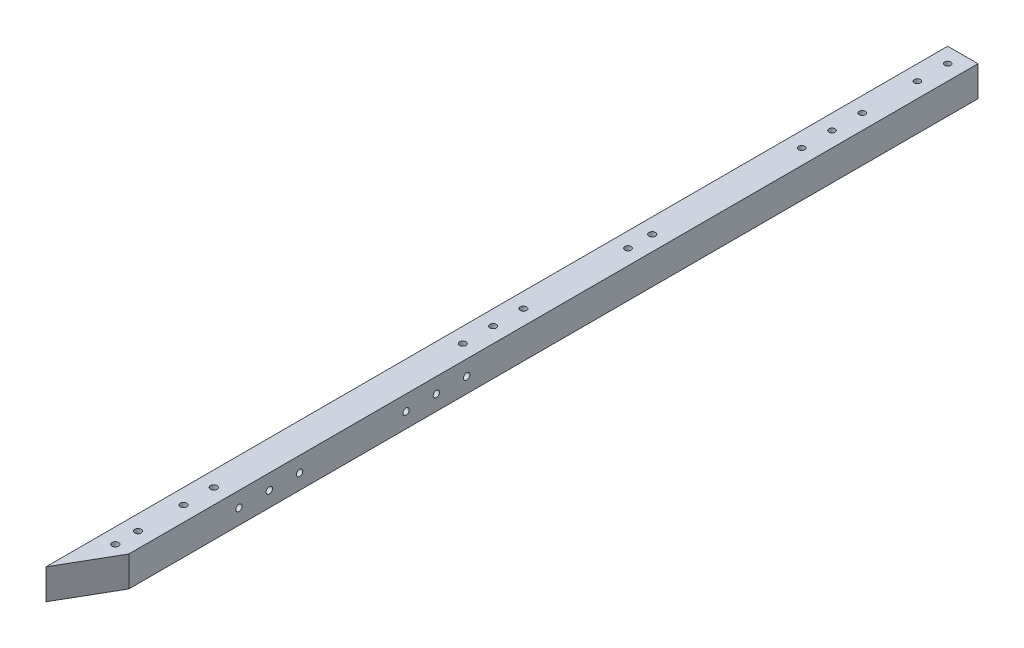
ISO-10303-21;
HEADER;
FILE_DESCRIPTION(('STEP AP214'),'2;1');
FILE_NAME('part.step','',(''),(''),'','','');
FILE_SCHEMA(('AUTOMOTIVE_DESIGN { 1 0 10303 214 1 1 1 1 }'));
ENDSEC;
DATA;
#1=APPLICATION_CONTEXT('core data for automotive mechanical design processes');
#2=APPLICATION_PROTOCOL_DEFINITION('international standard','automotive_design',2000,#1);
#3=PRODUCT_CONTEXT('',#1,'mechanical');
#4=PRODUCT('Part','Part','',(#3));
#5=PRODUCT_RELATED_PRODUCT_CATEGORY('part','',(#4));
#6=PRODUCT_DEFINITION_FORMATION('','',#4);
#7=PRODUCT_DEFINITION_CONTEXT('part definition',#1,'design');
#8=PRODUCT_DEFINITION('design','',#6,#7);
#9=PRODUCT_DEFINITION_SHAPE('','',#8);
#10=(LENGTH_UNIT() NAMED_UNIT(*) SI_UNIT(.MILLI.,.METRE.));
#11=(NAMED_UNIT(*) PLANE_ANGLE_UNIT() SI_UNIT($,.RADIAN.));
#12=(NAMED_UNIT(*) SI_UNIT($,.STERADIAN.) SOLID_ANGLE_UNIT());
#13=UNCERTAINTY_MEASURE_WITH_UNIT(LENGTH_MEASURE(1.E-05),#10,'distance_accuracy_value','');
#14=(GEOMETRIC_REPRESENTATION_CONTEXT(3) GLOBAL_UNCERTAINTY_ASSIGNED_CONTEXT((#13)) GLOBAL_UNIT_ASSIGNED_CONTEXT((#10,
#11,#12)) REPRESENTATION_CONTEXT('',''));
#15=CARTESIAN_POINT('',(0.,0.,0.));
#16=DIRECTION('',(0.,0.,1.));
#17=DIRECTION('',(1.,0.,0.));
#18=AXIS2_PLACEMENT_3D('',#15,#16,#17);
#19=CARTESIAN_POINT('',(0.,0.,595.07));
#20=DIRECTION('',(1.,0.,0.));
#21=DIRECTION('',(0.,0.,-1.));
#22=AXIS2_PLACEMENT_3D('',#19,#20,#21);
#23=PLANE('',#22);
#24=CARTESIAN_POINT('',(0.,9.9999999999999,337.46042392482));
#25=DIRECTION('',(1.,0.,0.));
#26=DIRECTION('',(0.,0.,-1.));
#27=AXIS2_PLACEMENT_3D('',#24,#25,#26);
#28=CIRCLE('',#27,2.10000000000005);
#29=CARTESIAN_POINT('',(0.,9.9999999999999,335.36042392482));
#30=VERTEX_POINT('',#29);
#31=EDGE_CURVE('E191',#30,#30,#28,.T.);
#32=ORIENTED_EDGE('',*,*,#31,.T.);
#33=EDGE_LOOP('',(#32));
#34=FACE_BOUND('',#33,.T.);
#35=CARTESIAN_POINT('',(0.,9.9999999999999,377.46042392482));
#36=DIRECTION('',(1.,0.,0.));
#37=DIRECTION('',(0.,0.,-1.));
#38=AXIS2_PLACEMENT_3D('',#35,#36,#37);
#39=CIRCLE('',#38,2.09999999999999);
#40=CARTESIAN_POINT('',(0.,9.9999999999999,375.36042392482));
#41=VERTEX_POINT('',#40);
#42=EDGE_CURVE('E198',#41,#41,#39,.T.);
#43=ORIENTED_EDGE('',*,*,#42,.T.);
#44=EDGE_LOOP('',(#43));
#45=FACE_BOUND('',#44,.T.);
#46=CARTESIAN_POINT('',(0.,9.9999999999999,357.46042392482));
#47=DIRECTION('',(1.,0.,0.));
#48=DIRECTION('',(0.,0.,-1.));
#49=AXIS2_PLACEMENT_3D('',#46,#47,#48);
#50=CIRCLE('',#49,2.09999999999999);
#51=CARTESIAN_POINT('',(0.,9.9999999999999,355.36042392482));
#52=VERTEX_POINT('',#51);
#53=EDGE_CURVE('E201',#52,#52,#50,.T.);
#54=ORIENTED_EDGE('',*,*,#53,.T.);
#55=EDGE_LOOP('',(#54));
#56=FACE_BOUND('',#55,.T.);
#57=CARTESIAN_POINT('',(0.,9.9999999999999,447.69045380482));
#58=DIRECTION('',(1.,0.,0.));
#59=DIRECTION('',(0.,0.,-1.));
#60=AXIS2_PLACEMENT_3D('',#57,#58,#59);
#61=CIRCLE('',#60,2.09999999999999);
#62=CARTESIAN_POINT('',(0.,9.9999999999999,445.59045380482));
#63=VERTEX_POINT('',#62);
#64=EDGE_CURVE('E204',#63,#63,#61,.T.);
#65=ORIENTED_EDGE('',*,*,#64,.T.);
#66=EDGE_LOOP('',(#65));
#67=FACE_BOUND('',#66,.T.);
#68=CARTESIAN_POINT('',(0.,9.99999999999984,487.69045380482));
#69=DIRECTION('',(1.,0.,0.));
#70=DIRECTION('',(0.,0.,-1.));
#71=AXIS2_PLACEMENT_3D('',#68,#69,#70);
#72=CIRCLE('',#71,2.09999999999999);
#73=CARTESIAN_POINT('',(0.,9.99999999999984,485.59045380482));
#74=VERTEX_POINT('',#73);
#75=EDGE_CURVE('E207',#74,#74,#72,.T.);
#76=ORIENTED_EDGE('',*,*,#75,.T.);
#77=EDGE_LOOP('',(#76));
#78=FACE_BOUND('',#77,.T.);
#79=CARTESIAN_POINT('',(0.,9.99999999999989,467.69045380482));
#80=DIRECTION('',(1.,0.,0.));
#81=DIRECTION('',(0.,0.,-1.));
#82=AXIS2_PLACEMENT_3D('',#79,#80,#81);
#83=CIRCLE('',#82,2.09999999999993);
#84=CARTESIAN_POINT('',(0.,9.99999999999989,465.59045380482));
#85=VERTEX_POINT('',#84);
#86=EDGE_CURVE('E210',#85,#85,#83,.T.);
#87=ORIENTED_EDGE('',*,*,#86,.T.);
#88=EDGE_LOOP('',(#87));
#89=FACE_BOUND('',#88,.T.);
#90=DIRECTION('',(0.,-1.,0.));
#91=VECTOR('',#90,1.);
#92=CARTESIAN_POINT('',(0.,0.,0.));
#93=LINE('',#92,#91);
#94=CARTESIAN_POINT('',(0.,20.,0.));
#95=VERTEX_POINT('',#94);
#96=CARTESIAN_POINT('',(0.,0.,0.));
#97=VERTEX_POINT('',#96);
#98=EDGE_CURVE('E89',#95,#97,#93,.T.);
#99=ORIENTED_EDGE('',*,*,#98,.T.);
#100=DIRECTION('',(0.,0.,-1.));
#101=VECTOR('',#100,1.);
#102=CARTESIAN_POINT('',(0.,0.,595.07));
#103=LINE('',#102,#101);
#104=CARTESIAN_POINT('',(0.,-2.22044604925031E-13,595.07));
#105=VERTEX_POINT('',#104);
#106=EDGE_CURVE('E11',#105,#97,#103,.T.);
#107=ORIENTED_EDGE('',*,*,#106,.F.);
#108=DIRECTION('',(0.,-1.,0.));
#109=VECTOR('',#108,1.);
#110=CARTESIAN_POINT('',(0.,0.,595.07));
#111=LINE('',#110,#109);
#112=CARTESIAN_POINT('',(0.,20.,595.07));
#113=VERTEX_POINT('',#112);
#114=EDGE_CURVE('E90',#113,#105,#111,.T.);
#115=ORIENTED_EDGE('',*,*,#114,.F.);
#116=DIRECTION('',(0.,0.,-1.));
#117=VECTOR('',#116,1.);
#118=CARTESIAN_POINT('',(0.,20.,595.07));
#119=LINE('',#118,#117);
#120=EDGE_CURVE('E76',#113,#95,#119,.T.);
#121=ORIENTED_EDGE('',*,*,#120,.T.);
#122=EDGE_LOOP('',(#99,#107,#115,#121));
#123=FACE_BOUND('',#122,.T.);
#124=ADVANCED_FACE('F36',(#34,#45,#56,#67,#78,#89,#123),#23,.F.);
#125=CARTESIAN_POINT('',(0.,0.,595.07));
#126=DIRECTION('',(0.,1.,0.));
#127=DIRECTION('',(0.,0.,1.));
#128=AXIS2_PLACEMENT_3D('',#125,#126,#127);
#129=PLANE('',#128);
#130=CARTESIAN_POINT('',(10.,0.,205.));
#131=DIRECTION('',(0.,1.,0.));
#132=DIRECTION('',(0.,0.,1.));
#133=AXIS2_PLACEMENT_3D('',#130,#131,#132);
#134=CIRCLE('',#133,2.15);
#135=CARTESIAN_POINT('',(10.,0.,207.15));
#136=VERTEX_POINT('',#135);
#137=EDGE_CURVE('E152',#136,#136,#134,.T.);
#138=ORIENTED_EDGE('',*,*,#137,.T.);
#139=EDGE_LOOP('',(#138));
#140=FACE_BOUND('',#139,.T.);
#141=CARTESIAN_POINT('',(10.,0.,330.));
#142=DIRECTION('',(0.,1.,0.));
#143=DIRECTION('',(0.,0.,1.));
#144=AXIS2_PLACEMENT_3D('',#141,#142,#143);
#145=CIRCLE('',#144,2.09999999999999);
#146=CARTESIAN_POINT('',(10.,0.,332.1));
#147=VERTEX_POINT('',#146);
#148=EDGE_CURVE('E168',#147,#147,#145,.T.);
#149=ORIENTED_EDGE('',*,*,#148,.T.);
#150=EDGE_LOOP('',(#149));
#151=FACE_BOUND('',#150,.T.);
#152=CARTESIAN_POINT('',(10.,0.,290.));
#153=DIRECTION('',(0.,1.,0.));
#154=DIRECTION('',(0.,0.,1.));
#155=AXIS2_PLACEMENT_3D('',#152,#153,#154);
#156=CIRCLE('',#155,2.09999999999999);
#157=CARTESIAN_POINT('',(10.,0.,292.1));
#158=VERTEX_POINT('',#157);
#159=EDGE_CURVE('E171',#158,#158,#156,.T.);
#160=ORIENTED_EDGE('',*,*,#159,.T.);
#161=EDGE_LOOP('',(#160));
#162=FACE_BOUND('',#161,.T.);
#163=CARTESIAN_POINT('',(10.,0.,310.));
#164=DIRECTION('',(0.,1.,0.));
#165=DIRECTION('',(0.,0.,1.));
#166=AXIS2_PLACEMENT_3D('',#163,#164,#165);
#167=CIRCLE('',#166,2.09999999999999);
#168=CARTESIAN_POINT('',(10.,0.,312.1));
#169=VERTEX_POINT('',#168);
#170=EDGE_CURVE('E174',#169,#169,#167,.T.);
#171=ORIENTED_EDGE('',*,*,#170,.T.);
#172=EDGE_LOOP('',(#171));
#173=FACE_BOUND('',#172,.T.);
#174=CARTESIAN_POINT('',(10.,0.,221.));
#175=DIRECTION('',(0.,1.,0.));
#176=DIRECTION('',(0.,0.,1.));
#177=AXIS2_PLACEMENT_3D('',#174,#175,#176);
#178=CIRCLE('',#177,2.09999999999999);
#179=CARTESIAN_POINT('',(10.,0.,223.1));
#180=VERTEX_POINT('',#179);
#181=EDGE_CURVE('E177',#180,#180,#178,.T.);
#182=ORIENTED_EDGE('',*,*,#181,.T.);
#183=EDGE_LOOP('',(#182));
#184=FACE_BOUND('',#183,.T.);
#185=CARTESIAN_POINT('',(9.99999999999999,-2.22044604925031E-13,494.338983848623));
#186=DIRECTION('',(0.,1.,0.));
#187=DIRECTION('',(0.,0.,1.));
#188=AXIS2_PLACEMENT_3D('',#185,#186,#187);
#189=CIRCLE('',#188,2.15);
#190=CARTESIAN_POINT('',(9.99999999999999,-2.22044604925031E-13,496.488983848623));
#191=VERTEX_POINT('',#190);
#192=EDGE_CURVE('E151',#191,#191,#189,.T.);
#193=ORIENTED_EDGE('',*,*,#192,.T.);
#194=EDGE_LOOP('',(#193));
#195=FACE_BOUND('',#194,.T.);
#196=CARTESIAN_POINT('',(9.99999999999999,-2.22044604925031E-13,514.338983848623));
#197=DIRECTION('',(0.,1.,0.));
#198=DIRECTION('',(0.,0.,1.));
#199=AXIS2_PLACEMENT_3D('',#196,#197,#198);
#200=CIRCLE('',#199,2.15);
#201=CARTESIAN_POINT('',(9.99999999999999,-2.22044604925031E-13,516.488983848623));
#202=VERTEX_POINT('',#201);
#203=EDGE_CURVE('E158',#202,#202,#200,.T.);
#204=ORIENTED_EDGE('',*,*,#203,.T.);
#205=EDGE_LOOP('',(#204));
#206=FACE_BOUND('',#205,.T.);
#207=CARTESIAN_POINT('',(9.99999999999999,-2.22044604925031E-13,559.338983848623));
#208=DIRECTION('',(0.,1.,0.));
#209=DIRECTION('',(0.,0.,1.));
#210=AXIS2_PLACEMENT_3D('',#207,#208,#209);
#211=CIRCLE('',#210,2.15000000000001);
#212=CARTESIAN_POINT('',(9.99999999999999,-2.22044604925031E-13,561.488983848623));
#213=VERTEX_POINT('',#212);
#214=EDGE_CURVE('E145',#213,#213,#211,.T.);
#215=ORIENTED_EDGE('',*,*,#214,.T.);
#216=EDGE_LOOP('',(#215));
#217=FACE_BOUND('',#216,.T.);
#218=CARTESIAN_POINT('',(9.99999999999999,-2.22044604925031E-13,544.338983848623));
#219=DIRECTION('',(0.,1.,0.));
#220=DIRECTION('',(0.,0.,1.));
#221=AXIS2_PLACEMENT_3D('',#218,#219,#220);
#222=CIRCLE('',#221,2.15);
#223=CARTESIAN_POINT('',(9.99999999999999,-2.22044604925031E-13,546.488983848623));
#224=VERTEX_POINT('',#223);
#225=EDGE_CURVE('E116',#224,#224,#222,.T.);
#226=ORIENTED_EDGE('',*,*,#225,.T.);
#227=EDGE_LOOP('',(#226));
#228=FACE_BOUND('',#227,.T.);
#229=CARTESIAN_POINT('',(10.,-2.22044604925031E-13,10.));
#230=DIRECTION('',(0.,1.,0.));
#231=DIRECTION('',(0.,0.,1.));
#232=AXIS2_PLACEMENT_3D('',#229,#230,#231);
#233=CIRCLE('',#232,2.);
#234=CARTESIAN_POINT('',(10.,-2.22044604925031E-13,12.));
#235=VERTEX_POINT('',#234);
#236=EDGE_CURVE('E111',#235,#235,#233,.T.);
#237=ORIENTED_EDGE('',*,*,#236,.T.);
#238=EDGE_LOOP('',(#237));
#239=FACE_BOUND('',#238,.T.);
#240=CARTESIAN_POINT('',(10.,-2.22044604925031E-13,30.));
#241=DIRECTION('',(0.,1.,0.));
#242=DIRECTION('',(0.,0.,1.));
#243=AXIS2_PLACEMENT_3D('',#240,#241,#242);
#244=CIRCLE('',#243,2.);
#245=CARTESIAN_POINT('',(10.,-2.22044604925031E-13,32.));
#246=VERTEX_POINT('',#245);
#247=EDGE_CURVE('E134',#246,#246,#244,.T.);
#248=ORIENTED_EDGE('',*,*,#247,.T.);
#249=EDGE_LOOP('',(#248));
#250=FACE_BOUND('',#249,.T.);
#251=CARTESIAN_POINT('',(10.,-2.22044604925031E-13,66.35));
#252=DIRECTION('',(0.,1.,0.));
#253=DIRECTION('',(0.,0.,1.));
#254=AXIS2_PLACEMENT_3D('',#251,#252,#253);
#255=CIRCLE('',#254,2.);
#256=CARTESIAN_POINT('',(10.,-2.22044604925031E-13,68.35));
#257=VERTEX_POINT('',#256);
#258=EDGE_CURVE('E128',#257,#257,#255,.T.);
#259=ORIENTED_EDGE('',*,*,#258,.T.);
#260=EDGE_LOOP('',(#259));
#261=FACE_BOUND('',#260,.T.);
#262=CARTESIAN_POINT('',(10.,-2.22044604925031E-13,86.35));
#263=DIRECTION('',(0.,1.,0.));
#264=DIRECTION('',(0.,0.,1.));
#265=AXIS2_PLACEMENT_3D('',#262,#263,#264);
#266=CIRCLE('',#265,2.);
#267=CARTESIAN_POINT('',(10.,-2.22044604925031E-13,88.35));
#268=VERTEX_POINT('',#267);
#269=EDGE_CURVE('E122',#268,#268,#266,.T.);
#270=ORIENTED_EDGE('',*,*,#269,.T.);
#271=EDGE_LOOP('',(#270));
#272=FACE_BOUND('',#271,.T.);
#273=CARTESIAN_POINT('',(10.,-2.22044604925031E-13,106.35));
#274=DIRECTION('',(0.,1.,0.));
#275=DIRECTION('',(0.,0.,1.));
#276=AXIS2_PLACEMENT_3D('',#273,#274,#275);
#277=CIRCLE('',#276,2.);
#278=CARTESIAN_POINT('',(10.,-2.22044604925031E-13,108.35));
#279=VERTEX_POINT('',#278);
#280=EDGE_CURVE('E115',#279,#279,#277,.T.);
#281=ORIENTED_EDGE('',*,*,#280,.T.);
#282=EDGE_LOOP('',(#281));
#283=FACE_BOUND('',#282,.T.);
#284=DIRECTION('',(0.,0.,-1.));
#285=VECTOR('',#284,1.);
#286=CARTESIAN_POINT('',(20.,0.,595.07));
#287=LINE('',#286,#285);
#288=CARTESIAN_POINT('',(20.,-2.22044604925031E-13,560.428983848623));
#289=VERTEX_POINT('',#288);
#290=CARTESIAN_POINT('',(20.,0.,0.));
#291=VERTEX_POINT('',#290);
#292=EDGE_CURVE('E44',#289,#291,#287,.T.);
#293=ORIENTED_EDGE('',*,*,#292,.F.);
#294=DIRECTION('',(-0.500000000000004,0.,0.866025403784436));
#295=VECTOR('',#294,1.);
#296=CARTESIAN_POINT('',(0.,0.,595.07));
#297=LINE('',#296,#295);
#298=EDGE_CURVE('E102',#289,#105,#297,.T.);
#299=ORIENTED_EDGE('',*,*,#298,.T.);
#300=ORIENTED_EDGE('',*,*,#106,.T.);
#301=DIRECTION('',(1.,0.,0.));
#302=VECTOR('',#301,1.);
#303=CARTESIAN_POINT('',(0.,0.,0.));
#304=LINE('',#303,#302);
#305=EDGE_CURVE('E84',#97,#291,#304,.T.);
#306=ORIENTED_EDGE('',*,*,#305,.T.);
#307=EDGE_LOOP('',(#293,#299,#300,#306));
#308=FACE_BOUND('',#307,.T.);
#309=ADVANCED_FACE('F104',(#140,#151,#162,#173,#184,#195,#206,#217,#228,#239,#250,#261,#272,
#283,#308),#129,.F.);
#310=CARTESIAN_POINT('',(20.,0.,595.07));
#311=DIRECTION('',(-1.,0.,0.));
#312=DIRECTION('',(0.,0.,1.));
#313=AXIS2_PLACEMENT_3D('',#310,#311,#312);
#314=PLANE('',#313);
#315=CARTESIAN_POINT('',(20.,9.9999999999999,337.46042392482));
#316=DIRECTION('',(1.,0.,0.));
#317=DIRECTION('',(0.,0.,-1.));
#318=AXIS2_PLACEMENT_3D('',#315,#316,#317);
#319=CIRCLE('',#318,2.10000000000005);
#320=CARTESIAN_POINT('',(20.,9.9999999999999,335.36042392482));
#321=VERTEX_POINT('',#320);
#322=EDGE_CURVE('E217',#321,#321,#319,.T.);
#323=ORIENTED_EDGE('',*,*,#322,.F.);
#324=EDGE_LOOP('',(#323));
#325=FACE_BOUND('',#324,.T.);
#326=CARTESIAN_POINT('',(20.,9.9999999999999,377.46042392482));
#327=DIRECTION('',(1.,0.,0.));
#328=DIRECTION('',(0.,0.,-1.));
#329=AXIS2_PLACEMENT_3D('',#326,#327,#328);
#330=CIRCLE('',#329,2.09999999999999);
#331=CARTESIAN_POINT('',(20.,9.9999999999999,375.36042392482));
#332=VERTEX_POINT('',#331);
#333=EDGE_CURVE('E220',#332,#332,#330,.T.);
#334=ORIENTED_EDGE('',*,*,#333,.F.);
#335=EDGE_LOOP('',(#334));
#336=FACE_BOUND('',#335,.T.);
#337=CARTESIAN_POINT('',(20.,9.9999999999999,357.46042392482));
#338=DIRECTION('',(1.,0.,0.));
#339=DIRECTION('',(0.,0.,-1.));
#340=AXIS2_PLACEMENT_3D('',#337,#338,#339);
#341=CIRCLE('',#340,2.09999999999999);
#342=CARTESIAN_POINT('',(20.,9.9999999999999,355.36042392482));
#343=VERTEX_POINT('',#342);
#344=EDGE_CURVE('E223',#343,#343,#341,.T.);
#345=ORIENTED_EDGE('',*,*,#344,.F.);
#346=EDGE_LOOP('',(#345));
#347=FACE_BOUND('',#346,.T.);
#348=CARTESIAN_POINT('',(20.,9.9999999999999,447.69045380482));
#349=DIRECTION('',(1.,0.,0.));
#350=DIRECTION('',(0.,0.,-1.));
#351=AXIS2_PLACEMENT_3D('',#348,#349,#350);
#352=CIRCLE('',#351,2.09999999999999);
#353=CARTESIAN_POINT('',(20.,9.9999999999999,445.59045380482));
#354=VERTEX_POINT('',#353);
#355=EDGE_CURVE('E226',#354,#354,#352,.T.);
#356=ORIENTED_EDGE('',*,*,#355,.F.);
#357=EDGE_LOOP('',(#356));
#358=FACE_BOUND('',#357,.T.);
#359=CARTESIAN_POINT('',(20.,9.99999999999984,487.69045380482));
#360=DIRECTION('',(1.,0.,0.));
#361=DIRECTION('',(0.,0.,-1.));
#362=AXIS2_PLACEMENT_3D('',#359,#360,#361);
#363=CIRCLE('',#362,2.09999999999999);
#364=CARTESIAN_POINT('',(20.,9.99999999999984,485.59045380482));
#365=VERTEX_POINT('',#364);
#366=EDGE_CURVE('E216',#365,#365,#363,.T.);
#367=ORIENTED_EDGE('',*,*,#366,.F.);
#368=EDGE_LOOP('',(#367));
#369=FACE_BOUND('',#368,.T.);
#370=CARTESIAN_POINT('',(20.,9.99999999999989,467.69045380482));
#371=DIRECTION('',(1.,0.,0.));
#372=DIRECTION('',(0.,0.,-1.));
#373=AXIS2_PLACEMENT_3D('',#370,#371,#372);
#374=CIRCLE('',#373,2.09999999999993);
#375=CARTESIAN_POINT('',(20.,9.99999999999989,465.59045380482));
#376=VERTEX_POINT('',#375);
#377=EDGE_CURVE('E213',#376,#376,#374,.T.);
#378=ORIENTED_EDGE('',*,*,#377,.F.);
#379=EDGE_LOOP('',(#378));
#380=FACE_BOUND('',#379,.T.);
#381=DIRECTION('',(0.,0.,-1.));
#382=VECTOR('',#381,1.);
#383=CARTESIAN_POINT('',(20.,20.,595.07));
#384=LINE('',#383,#382);
#385=CARTESIAN_POINT('',(20.,20.,560.428983848623));
#386=VERTEX_POINT('',#385);
#387=CARTESIAN_POINT('',(20.,20.,0.));
#388=VERTEX_POINT('',#387);
#389=EDGE_CURVE('E67',#386,#388,#384,.T.);
#390=ORIENTED_EDGE('',*,*,#389,.F.);
#391=DIRECTION('',(0.,1.,0.));
#392=VECTOR('',#391,1.);
#393=CARTESIAN_POINT('',(20.,-575.07,560.428983848623));
#394=LINE('',#393,#392);
#395=EDGE_CURVE('E105',#289,#386,#394,.T.);
#396=ORIENTED_EDGE('',*,*,#395,.F.);
#397=ORIENTED_EDGE('',*,*,#292,.T.);
#398=DIRECTION('',(0.,1.,0.));
#399=VECTOR('',#398,1.);
#400=CARTESIAN_POINT('',(20.,0.,0.));
#401=LINE('',#400,#399);
#402=EDGE_CURVE('E79',#291,#388,#401,.T.);
#403=ORIENTED_EDGE('',*,*,#402,.T.);
#404=EDGE_LOOP('',(#390,#396,#397,#403));
#405=FACE_BOUND('',#404,.T.);
#406=ADVANCED_FACE('F80',(#325,#336,#347,#358,#369,#380,#405),#314,.F.);
#407=CARTESIAN_POINT('',(0.,20.,595.07));
#408=DIRECTION('',(0.,-1.,0.));
#409=DIRECTION('',(0.,0.,-1.));
#410=AXIS2_PLACEMENT_3D('',#407,#408,#409);
#411=PLANE('',#410);
#412=CARTESIAN_POINT('',(10.,20.,205.));
#413=DIRECTION('',(0.,1.,0.));
#414=DIRECTION('',(0.,0.,1.));
#415=AXIS2_PLACEMENT_3D('',#412,#413,#414);
#416=CIRCLE('',#415,2.15);
#417=CARTESIAN_POINT('',(10.,20.,207.15));
#418=VERTEX_POINT('',#417);
#419=EDGE_CURVE('E180',#418,#418,#416,.T.);
#420=ORIENTED_EDGE('',*,*,#419,.F.);
#421=EDGE_LOOP('',(#420));
#422=FACE_BOUND('',#421,.T.);
#423=CARTESIAN_POINT('',(10.,20.,330.));
#424=DIRECTION('',(0.,1.,0.));
#425=DIRECTION('',(0.,0.,1.));
#426=AXIS2_PLACEMENT_3D('',#423,#424,#425);
#427=CIRCLE('',#426,2.09999999999999);
#428=CARTESIAN_POINT('',(10.,20.,332.1));
#429=VERTEX_POINT('',#428);
#430=EDGE_CURVE('E188',#429,#429,#427,.T.);
#431=ORIENTED_EDGE('',*,*,#430,.F.);
#432=EDGE_LOOP('',(#431));
#433=FACE_BOUND('',#432,.T.);
#434=CARTESIAN_POINT('',(10.,20.,290.));
#435=DIRECTION('',(0.,1.,0.));
#436=DIRECTION('',(0.,0.,1.));
#437=AXIS2_PLACEMENT_3D('',#434,#435,#436);
#438=CIRCLE('',#437,2.09999999999999);
#439=CARTESIAN_POINT('',(10.,20.,292.1));
#440=VERTEX_POINT('',#439);
#441=EDGE_CURVE('E185',#440,#440,#438,.T.);
#442=ORIENTED_EDGE('',*,*,#441,.F.);
#443=EDGE_LOOP('',(#442));
#444=FACE_BOUND('',#443,.T.);
#445=CARTESIAN_POINT('',(10.,20.,310.));
#446=DIRECTION('',(0.,1.,0.));
#447=DIRECTION('',(0.,0.,1.));
#448=AXIS2_PLACEMENT_3D('',#445,#446,#447);
#449=CIRCLE('',#448,2.09999999999999);
#450=CARTESIAN_POINT('',(10.,20.,312.1));
#451=VERTEX_POINT('',#450);
#452=EDGE_CURVE('E181',#451,#451,#449,.T.);
#453=ORIENTED_EDGE('',*,*,#452,.F.);
#454=EDGE_LOOP('',(#453));
#455=FACE_BOUND('',#454,.T.);
#456=CARTESIAN_POINT('',(10.,20.,221.));
#457=DIRECTION('',(0.,1.,0.));
#458=DIRECTION('',(0.,0.,1.));
#459=AXIS2_PLACEMENT_3D('',#456,#457,#458);
#460=CIRCLE('',#459,2.09999999999999);
#461=CARTESIAN_POINT('',(10.,20.,223.1));
#462=VERTEX_POINT('',#461);
#463=EDGE_CURVE('E184',#462,#462,#460,.T.);
#464=ORIENTED_EDGE('',*,*,#463,.F.);
#465=EDGE_LOOP('',(#464));
#466=FACE_BOUND('',#465,.T.);
#467=CARTESIAN_POINT('',(9.99999999999999,20.,494.338983848623));
#468=DIRECTION('',(0.,1.,0.));
#469=DIRECTION('',(0.,0.,1.));
#470=AXIS2_PLACEMENT_3D('',#467,#468,#469);
#471=CIRCLE('',#470,2.15);
#472=CARTESIAN_POINT('',(9.99999999999999,20.,496.488983848623));
#473=VERTEX_POINT('',#472);
#474=EDGE_CURVE('E148',#473,#473,#471,.T.);
#475=ORIENTED_EDGE('',*,*,#474,.F.);
#476=EDGE_LOOP('',(#475));
#477=FACE_BOUND('',#476,.T.);
#478=CARTESIAN_POINT('',(9.99999999999999,20.,514.338983848623));
#479=DIRECTION('',(0.,1.,0.));
#480=DIRECTION('',(0.,0.,1.));
#481=AXIS2_PLACEMENT_3D('',#478,#479,#480);
#482=CIRCLE('',#481,2.15);
#483=CARTESIAN_POINT('',(9.99999999999999,20.,516.488983848623));
#484=VERTEX_POINT('',#483);
#485=EDGE_CURVE('E155',#484,#484,#482,.T.);
#486=ORIENTED_EDGE('',*,*,#485,.F.);
#487=EDGE_LOOP('',(#486));
#488=FACE_BOUND('',#487,.T.);
#489=CARTESIAN_POINT('',(9.99999999999999,20.,559.338983848623));
#490=DIRECTION('',(0.,1.,0.));
#491=DIRECTION('',(0.,0.,1.));
#492=AXIS2_PLACEMENT_3D('',#489,#490,#491);
#493=CIRCLE('',#492,2.15000000000001);
#494=CARTESIAN_POINT('',(9.99999999999999,20.,561.488983848623));
#495=VERTEX_POINT('',#494);
#496=EDGE_CURVE('E161',#495,#495,#493,.T.);
#497=ORIENTED_EDGE('',*,*,#496,.F.);
#498=EDGE_LOOP('',(#497));
#499=FACE_BOUND('',#498,.T.);
#500=CARTESIAN_POINT('',(9.99999999999999,20.,544.338983848623));
#501=DIRECTION('',(0.,1.,0.));
#502=DIRECTION('',(0.,0.,1.));
#503=AXIS2_PLACEMENT_3D('',#500,#501,#502);
#504=CIRCLE('',#503,2.15);
#505=CARTESIAN_POINT('',(9.99999999999999,20.,546.488983848623));
#506=VERTEX_POINT('',#505);
#507=EDGE_CURVE('E142',#506,#506,#504,.T.);
#508=ORIENTED_EDGE('',*,*,#507,.F.);
#509=EDGE_LOOP('',(#508));
#510=FACE_BOUND('',#509,.T.);
#511=CARTESIAN_POINT('',(10.,20.,10.));
#512=DIRECTION('',(0.,1.,0.));
#513=DIRECTION('',(0.,0.,1.));
#514=AXIS2_PLACEMENT_3D('',#511,#512,#513);
#515=CIRCLE('',#514,2.);
#516=CARTESIAN_POINT('',(10.,20.,12.));
#517=VERTEX_POINT('',#516);
#518=EDGE_CURVE('E137',#517,#517,#515,.T.);
#519=ORIENTED_EDGE('',*,*,#518,.F.);
#520=EDGE_LOOP('',(#519));
#521=FACE_BOUND('',#520,.T.);
#522=CARTESIAN_POINT('',(10.,20.,30.));
#523=DIRECTION('',(0.,1.,0.));
#524=DIRECTION('',(0.,0.,1.));
#525=AXIS2_PLACEMENT_3D('',#522,#523,#524);
#526=CIRCLE('',#525,2.);
#527=CARTESIAN_POINT('',(10.,20.,32.));
#528=VERTEX_POINT('',#527);
#529=EDGE_CURVE('E131',#528,#528,#526,.T.);
#530=ORIENTED_EDGE('',*,*,#529,.F.);
#531=EDGE_LOOP('',(#530));
#532=FACE_BOUND('',#531,.T.);
#533=CARTESIAN_POINT('',(10.,20.,66.35));
#534=DIRECTION('',(0.,1.,0.));
#535=DIRECTION('',(0.,0.,1.));
#536=AXIS2_PLACEMENT_3D('',#533,#534,#535);
#537=CIRCLE('',#536,2.);
#538=CARTESIAN_POINT('',(10.,20.,68.35));
#539=VERTEX_POINT('',#538);
#540=EDGE_CURVE('E125',#539,#539,#537,.T.);
#541=ORIENTED_EDGE('',*,*,#540,.F.);
#542=EDGE_LOOP('',(#541));
#543=FACE_BOUND('',#542,.T.);
#544=CARTESIAN_POINT('',(10.,20.,86.35));
#545=DIRECTION('',(0.,1.,0.));
#546=DIRECTION('',(0.,0.,1.));
#547=AXIS2_PLACEMENT_3D('',#544,#545,#546);
#548=CIRCLE('',#547,2.);
#549=CARTESIAN_POINT('',(10.,20.,88.35));
#550=VERTEX_POINT('',#549);
#551=EDGE_CURVE('E119',#550,#550,#548,.T.);
#552=ORIENTED_EDGE('',*,*,#551,.F.);
#553=EDGE_LOOP('',(#552));
#554=FACE_BOUND('',#553,.T.);
#555=CARTESIAN_POINT('',(10.,20.,106.35));
#556=DIRECTION('',(0.,1.,0.));
#557=DIRECTION('',(0.,0.,1.));
#558=AXIS2_PLACEMENT_3D('',#555,#556,#557);
#559=CIRCLE('',#558,2.);
#560=CARTESIAN_POINT('',(10.,20.,108.35));
#561=VERTEX_POINT('',#560);
#562=EDGE_CURVE('E112',#561,#561,#559,.T.);
#563=ORIENTED_EDGE('',*,*,#562,.F.);
#564=EDGE_LOOP('',(#563));
#565=FACE_BOUND('',#564,.T.);
#566=ORIENTED_EDGE('',*,*,#120,.F.);
#567=DIRECTION('',(-0.500000000000004,0.,0.866025403784436));
#568=VECTOR('',#567,1.);
#569=CARTESIAN_POINT('',(0.,20.,595.07));
#570=LINE('',#569,#568);
#571=EDGE_CURVE('E51',#386,#113,#570,.T.);
#572=ORIENTED_EDGE('',*,*,#571,.F.);
#573=ORIENTED_EDGE('',*,*,#389,.T.);
#574=DIRECTION('',(-1.,0.,0.));
#575=VECTOR('',#574,1.);
#576=CARTESIAN_POINT('',(0.,20.,0.));
#577=LINE('',#576,#575);
#578=EDGE_CURVE('E71',#388,#95,#577,.T.);
#579=ORIENTED_EDGE('',*,*,#578,.T.);
#580=EDGE_LOOP('',(#566,#572,#573,#579));
#581=FACE_BOUND('',#580,.T.);
#582=ADVANCED_FACE('F69',(#422,#433,#444,#455,#466,#477,#488,#499,#510,#521,#532,#543,#554,#565,
#581),#411,.F.);
#583=CARTESIAN_POINT('',(0.,0.,0.));
#584=DIRECTION('',(0.,0.,-1.));
#585=DIRECTION('',(-1.,0.,0.));
#586=AXIS2_PLACEMENT_3D('',#583,#584,#585);
#587=PLANE('',#586);
#588=ORIENTED_EDGE('',*,*,#98,.F.);
#589=ORIENTED_EDGE('',*,*,#578,.F.);
#590=ORIENTED_EDGE('',*,*,#402,.F.);
#591=ORIENTED_EDGE('',*,*,#305,.F.);
#592=EDGE_LOOP('',(#588,#589,#590,#591));
#593=FACE_BOUND('',#592,.T.);
#594=ADVANCED_FACE('F87',(#593),#587,.T.);
#595=CARTESIAN_POINT('',(0.,-575.07,595.07));
#596=DIRECTION('',(-0.866025403784436,0.,-0.500000000000004));
#597=DIRECTION('',(-0.500000000000004,0.,0.866025403784436));
#598=AXIS2_PLACEMENT_3D('',#595,#596,#597);
#599=PLANE('',#598);
#600=ORIENTED_EDGE('',*,*,#395,.T.);
#601=ORIENTED_EDGE('',*,*,#571,.T.);
#602=ORIENTED_EDGE('',*,*,#114,.T.);
#603=ORIENTED_EDGE('',*,*,#298,.F.);
#604=EDGE_LOOP('',(#600,#601,#602,#603));
#605=FACE_BOUND('',#604,.T.);
#606=ADVANCED_FACE('F100',(#605),#599,.F.);
#607=CARTESIAN_POINT('',(10.,-2.22044604925031E-13,106.35));
#608=DIRECTION('',(0.,1.,0.));
#609=DIRECTION('',(0.,0.,1.));
#610=AXIS2_PLACEMENT_3D('',#607,#608,#609);
#611=CYLINDRICAL_SURFACE('',#610,2.);
#612=ORIENTED_EDGE('',*,*,#280,.F.);
#613=EDGE_LOOP('',(#612));
#614=FACE_BOUND('',#613,.T.);
#615=ORIENTED_EDGE('',*,*,#562,.T.);
#616=EDGE_LOOP('',(#615));
#617=FACE_BOUND('',#616,.T.);
#618=ADVANCED_FACE('F334',(#614,#617),#611,.F.);
#619=CARTESIAN_POINT('',(10.,-2.22044604925031E-13,86.35));
#620=DIRECTION('',(0.,1.,0.));
#621=DIRECTION('',(0.,0.,1.));
#622=AXIS2_PLACEMENT_3D('',#619,#620,#621);
#623=CYLINDRICAL_SURFACE('',#622,2.);
#624=ORIENTED_EDGE('',*,*,#269,.F.);
#625=EDGE_LOOP('',(#624));
#626=FACE_BOUND('',#625,.T.);
#627=ORIENTED_EDGE('',*,*,#551,.T.);
#628=EDGE_LOOP('',(#627));
#629=FACE_BOUND('',#628,.T.);
#630=ADVANCED_FACE('F330',(#626,#629),#623,.F.);
#631=CARTESIAN_POINT('',(10.,-2.22044604925031E-13,66.35));
#632=DIRECTION('',(0.,1.,0.));
#633=DIRECTION('',(0.,0.,1.));
#634=AXIS2_PLACEMENT_3D('',#631,#632,#633);
#635=CYLINDRICAL_SURFACE('',#634,2.);
#636=ORIENTED_EDGE('',*,*,#258,.F.);
#637=EDGE_LOOP('',(#636));
#638=FACE_BOUND('',#637,.T.);
#639=ORIENTED_EDGE('',*,*,#540,.T.);
#640=EDGE_LOOP('',(#639));
#641=FACE_BOUND('',#640,.T.);
#642=ADVANCED_FACE('F326',(#638,#641),#635,.F.);
#643=CARTESIAN_POINT('',(10.,-2.22044604925031E-13,30.));
#644=DIRECTION('',(0.,1.,0.));
#645=DIRECTION('',(0.,0.,1.));
#646=AXIS2_PLACEMENT_3D('',#643,#644,#645);
#647=CYLINDRICAL_SURFACE('',#646,2.);
#648=ORIENTED_EDGE('',*,*,#247,.F.);
#649=EDGE_LOOP('',(#648));
#650=FACE_BOUND('',#649,.T.);
#651=ORIENTED_EDGE('',*,*,#529,.T.);
#652=EDGE_LOOP('',(#651));
#653=FACE_BOUND('',#652,.T.);
#654=ADVANCED_FACE('F322',(#650,#653),#647,.F.);
#655=CARTESIAN_POINT('',(10.,-2.22044604925031E-13,10.));
#656=DIRECTION('',(0.,1.,0.));
#657=DIRECTION('',(0.,0.,1.));
#658=AXIS2_PLACEMENT_3D('',#655,#656,#657);
#659=CYLINDRICAL_SURFACE('',#658,2.);
#660=ORIENTED_EDGE('',*,*,#236,.F.);
#661=EDGE_LOOP('',(#660));
#662=FACE_BOUND('',#661,.T.);
#663=ORIENTED_EDGE('',*,*,#518,.T.);
#664=EDGE_LOOP('',(#663));
#665=FACE_BOUND('',#664,.T.);
#666=ADVANCED_FACE('F318',(#662,#665),#659,.F.);
#667=CARTESIAN_POINT('',(9.99999999999999,-2.22044604925031E-13,544.338983848623));
#668=DIRECTION('',(0.,1.,0.));
#669=DIRECTION('',(0.,0.,1.));
#670=AXIS2_PLACEMENT_3D('',#667,#668,#669);
#671=CYLINDRICAL_SURFACE('',#670,2.15);
#672=ORIENTED_EDGE('',*,*,#225,.F.);
#673=EDGE_LOOP('',(#672));
#674=FACE_BOUND('',#673,.T.);
#675=ORIENTED_EDGE('',*,*,#507,.T.);
#676=EDGE_LOOP('',(#675));
#677=FACE_BOUND('',#676,.T.);
#678=ADVANCED_FACE('F308',(#674,#677),#671,.F.);
#679=CARTESIAN_POINT('',(9.99999999999999,-2.22044604925031E-13,559.338983848623));
#680=DIRECTION('',(0.,1.,0.));
#681=DIRECTION('',(0.,0.,1.));
#682=AXIS2_PLACEMENT_3D('',#679,#680,#681);
#683=CYLINDRICAL_SURFACE('',#682,2.15000000000001);
#684=ORIENTED_EDGE('',*,*,#214,.F.);
#685=EDGE_LOOP('',(#684));
#686=FACE_BOUND('',#685,.T.);
#687=ORIENTED_EDGE('',*,*,#496,.T.);
#688=EDGE_LOOP('',(#687));
#689=FACE_BOUND('',#688,.T.);
#690=ADVANCED_FACE('F304',(#686,#689),#683,.F.);
#691=CARTESIAN_POINT('',(9.99999999999999,-2.22044604925031E-13,514.338983848623));
#692=DIRECTION('',(0.,1.,0.));
#693=DIRECTION('',(0.,0.,1.));
#694=AXIS2_PLACEMENT_3D('',#691,#692,#693);
#695=CYLINDRICAL_SURFACE('',#694,2.15);
#696=ORIENTED_EDGE('',*,*,#203,.F.);
#697=EDGE_LOOP('',(#696));
#698=FACE_BOUND('',#697,.T.);
#699=ORIENTED_EDGE('',*,*,#485,.T.);
#700=EDGE_LOOP('',(#699));
#701=FACE_BOUND('',#700,.T.);
#702=ADVANCED_FACE('F307',(#698,#701),#695,.F.);
#703=CARTESIAN_POINT('',(9.99999999999999,-2.22044604925031E-13,494.338983848623));
#704=DIRECTION('',(0.,1.,0.));
#705=DIRECTION('',(0.,0.,1.));
#706=AXIS2_PLACEMENT_3D('',#703,#704,#705);
#707=CYLINDRICAL_SURFACE('',#706,2.15);
#708=ORIENTED_EDGE('',*,*,#192,.F.);
#709=EDGE_LOOP('',(#708));
#710=FACE_BOUND('',#709,.T.);
#711=ORIENTED_EDGE('',*,*,#474,.T.);
#712=EDGE_LOOP('',(#711));
#713=FACE_BOUND('',#712,.T.);
#714=ADVANCED_FACE('F299',(#710,#713),#707,.F.);
#715=CARTESIAN_POINT('',(10.,-117.,221.));
#716=DIRECTION('',(0.,1.,0.));
#717=DIRECTION('',(0.,0.,1.));
#718=AXIS2_PLACEMENT_3D('',#715,#716,#717);
#719=CYLINDRICAL_SURFACE('',#718,2.09999999999999);
#720=ORIENTED_EDGE('',*,*,#463,.T.);
#721=EDGE_LOOP('',(#720));
#722=FACE_BOUND('',#721,.T.);
#723=ORIENTED_EDGE('',*,*,#181,.F.);
#724=EDGE_LOOP('',(#723));
#725=FACE_BOUND('',#724,.T.);
#726=ADVANCED_FACE('F296',(#722,#725),#719,.F.);
#727=CARTESIAN_POINT('',(10.,-117.,310.));
#728=DIRECTION('',(0.,1.,0.));
#729=DIRECTION('',(0.,0.,1.));
#730=AXIS2_PLACEMENT_3D('',#727,#728,#729);
#731=CYLINDRICAL_SURFACE('',#730,2.09999999999999);
#732=ORIENTED_EDGE('',*,*,#452,.T.);
#733=EDGE_LOOP('',(#732));
#734=FACE_BOUND('',#733,.T.);
#735=ORIENTED_EDGE('',*,*,#170,.F.);
#736=EDGE_LOOP('',(#735));
#737=FACE_BOUND('',#736,.T.);
#738=ADVANCED_FACE('F291',(#734,#737),#731,.F.);
#739=CARTESIAN_POINT('',(10.,-117.,290.));
#740=DIRECTION('',(0.,1.,0.));
#741=DIRECTION('',(0.,0.,1.));
#742=AXIS2_PLACEMENT_3D('',#739,#740,#741);
#743=CYLINDRICAL_SURFACE('',#742,2.09999999999999);
#744=ORIENTED_EDGE('',*,*,#441,.T.);
#745=EDGE_LOOP('',(#744));
#746=FACE_BOUND('',#745,.T.);
#747=ORIENTED_EDGE('',*,*,#159,.F.);
#748=EDGE_LOOP('',(#747));
#749=FACE_BOUND('',#748,.T.);
#750=ADVANCED_FACE('F288',(#746,#749),#743,.F.);
#751=CARTESIAN_POINT('',(10.,-117.,330.));
#752=DIRECTION('',(0.,1.,0.));
#753=DIRECTION('',(0.,0.,1.));
#754=AXIS2_PLACEMENT_3D('',#751,#752,#753);
#755=CYLINDRICAL_SURFACE('',#754,2.09999999999999);
#756=ORIENTED_EDGE('',*,*,#430,.T.);
#757=EDGE_LOOP('',(#756));
#758=FACE_BOUND('',#757,.T.);
#759=ORIENTED_EDGE('',*,*,#148,.F.);
#760=EDGE_LOOP('',(#759));
#761=FACE_BOUND('',#760,.T.);
#762=ADVANCED_FACE('F286',(#758,#761),#755,.F.);
#763=CARTESIAN_POINT('',(10.,-117.,205.));
#764=DIRECTION('',(0.,1.,0.));
#765=DIRECTION('',(0.,0.,1.));
#766=AXIS2_PLACEMENT_3D('',#763,#764,#765);
#767=CYLINDRICAL_SURFACE('',#766,2.15);
#768=ORIENTED_EDGE('',*,*,#419,.T.);
#769=EDGE_LOOP('',(#768));
#770=FACE_BOUND('',#769,.T.);
#771=ORIENTED_EDGE('',*,*,#137,.F.);
#772=EDGE_LOOP('',(#771));
#773=FACE_BOUND('',#772,.T.);
#774=ADVANCED_FACE('F244',(#770,#773),#767,.F.);
#775=CARTESIAN_POINT('',(-12.,9.99999999999989,467.69045380482));
#776=DIRECTION('',(1.,0.,0.));
#777=DIRECTION('',(0.,0.,-1.));
#778=AXIS2_PLACEMENT_3D('',#775,#776,#777);
#779=CYLINDRICAL_SURFACE('',#778,2.09999999999993);
#780=ORIENTED_EDGE('',*,*,#377,.T.);
#781=EDGE_LOOP('',(#780));
#782=FACE_BOUND('',#781,.T.);
#783=ORIENTED_EDGE('',*,*,#86,.F.);
#784=EDGE_LOOP('',(#783));
#785=FACE_BOUND('',#784,.T.);
#786=ADVANCED_FACE('F241',(#782,#785),#779,.F.);
#787=CARTESIAN_POINT('',(-12.,9.99999999999984,487.69045380482));
#788=DIRECTION('',(1.,0.,0.));
#789=DIRECTION('',(0.,0.,-1.));
#790=AXIS2_PLACEMENT_3D('',#787,#788,#789);
#791=CYLINDRICAL_SURFACE('',#790,2.09999999999999);
#792=ORIENTED_EDGE('',*,*,#366,.T.);
#793=EDGE_LOOP('',(#792));
#794=FACE_BOUND('',#793,.T.);
#795=ORIENTED_EDGE('',*,*,#75,.F.);
#796=EDGE_LOOP('',(#795));
#797=FACE_BOUND('',#796,.T.);
#798=ADVANCED_FACE('F232',(#794,#797),#791,.F.);
#799=CARTESIAN_POINT('',(-12.,9.9999999999999,447.69045380482));
#800=DIRECTION('',(1.,0.,0.));
#801=DIRECTION('',(0.,0.,-1.));
#802=AXIS2_PLACEMENT_3D('',#799,#800,#801);
#803=CYLINDRICAL_SURFACE('',#802,2.09999999999999);
#804=ORIENTED_EDGE('',*,*,#355,.T.);
#805=EDGE_LOOP('',(#804));
#806=FACE_BOUND('',#805,.T.);
#807=ORIENTED_EDGE('',*,*,#64,.F.);
#808=EDGE_LOOP('',(#807));
#809=FACE_BOUND('',#808,.T.);
#810=ADVANCED_FACE('F264',(#806,#809),#803,.F.);
#811=CARTESIAN_POINT('',(-12.,9.9999999999999,357.46042392482));
#812=DIRECTION('',(1.,0.,0.));
#813=DIRECTION('',(0.,0.,-1.));
#814=AXIS2_PLACEMENT_3D('',#811,#812,#813);
#815=CYLINDRICAL_SURFACE('',#814,2.09999999999999);
#816=ORIENTED_EDGE('',*,*,#344,.T.);
#817=EDGE_LOOP('',(#816));
#818=FACE_BOUND('',#817,.T.);
#819=ORIENTED_EDGE('',*,*,#53,.F.);
#820=EDGE_LOOP('',(#819));
#821=FACE_BOUND('',#820,.T.);
#822=ADVANCED_FACE('F269',(#818,#821),#815,.F.);
#823=CARTESIAN_POINT('',(-12.,9.9999999999999,377.46042392482));
#824=DIRECTION('',(1.,0.,0.));
#825=DIRECTION('',(0.,0.,-1.));
#826=AXIS2_PLACEMENT_3D('',#823,#824,#825);
#827=CYLINDRICAL_SURFACE('',#826,2.09999999999999);
#828=ORIENTED_EDGE('',*,*,#333,.T.);
#829=EDGE_LOOP('',(#828));
#830=FACE_BOUND('',#829,.T.);
#831=ORIENTED_EDGE('',*,*,#42,.F.);
#832=EDGE_LOOP('',(#831));
#833=FACE_BOUND('',#832,.T.);
#834=ADVANCED_FACE('F275',(#830,#833),#827,.F.);
#835=CARTESIAN_POINT('',(-12.,9.9999999999999,337.46042392482));
#836=DIRECTION('',(1.,0.,0.));
#837=DIRECTION('',(0.,0.,-1.));
#838=AXIS2_PLACEMENT_3D('',#835,#836,#837);
#839=CYLINDRICAL_SURFACE('',#838,2.10000000000005);
#840=ORIENTED_EDGE('',*,*,#322,.T.);
#841=EDGE_LOOP('',(#840));
#842=FACE_BOUND('',#841,.T.);
#843=ORIENTED_EDGE('',*,*,#31,.F.);
#844=EDGE_LOOP('',(#843));
#845=FACE_BOUND('',#844,.T.);
#846=ADVANCED_FACE('F279',(#842,#845),#839,.F.);
#847=CLOSED_SHELL('',(#124,#309,#406,#582,#594,#606,#618,#630,#642,#654,#666,#678,#690,#702,
#714,#726,#738,#750,#762,#774,#786,#798,#810,#822,#834,#846));
#848=MANIFOLD_SOLID_BREP('B2',#847);
#849=ADVANCED_BREP_SHAPE_REPRESENTATION('',(#18,#848),#14);
#850=SHAPE_DEFINITION_REPRESENTATION(#9,#849);
ENDSEC;
END-ISO-10303-21;
